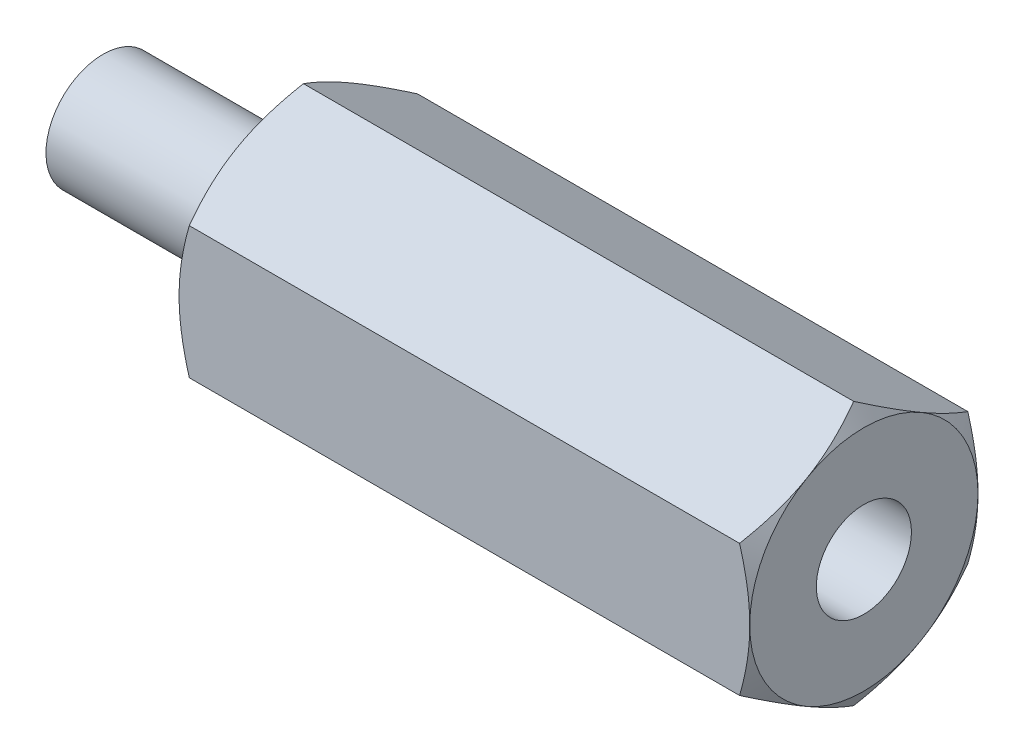
ISO-10303-21;
HEADER;
FILE_DESCRIPTION(('STEP AP214'),'2;1');
FILE_NAME('part.step','',(''),(''),'','','');
FILE_SCHEMA(('AUTOMOTIVE_DESIGN { 1 0 10303 214 1 1 1 1 }'));
ENDSEC;
DATA;
#1=APPLICATION_CONTEXT('core data for automotive mechanical design processes');
#2=APPLICATION_PROTOCOL_DEFINITION('international standard','automotive_design',2000,#1);
#3=PRODUCT_CONTEXT('',#1,'mechanical');
#4=PRODUCT('Part','Part','',(#3));
#5=PRODUCT_RELATED_PRODUCT_CATEGORY('part','',(#4));
#6=PRODUCT_DEFINITION_FORMATION('','',#4);
#7=PRODUCT_DEFINITION_CONTEXT('part definition',#1,'design');
#8=PRODUCT_DEFINITION('design','',#6,#7);
#9=PRODUCT_DEFINITION_SHAPE('','',#8);
#10=(LENGTH_UNIT() NAMED_UNIT(*) SI_UNIT(.MILLI.,.METRE.));
#11=(NAMED_UNIT(*) PLANE_ANGLE_UNIT() SI_UNIT($,.RADIAN.));
#12=(NAMED_UNIT(*) SI_UNIT($,.STERADIAN.) SOLID_ANGLE_UNIT());
#13=UNCERTAINTY_MEASURE_WITH_UNIT(LENGTH_MEASURE(1.E-05),#10,'distance_accuracy_value','');
#14=(GEOMETRIC_REPRESENTATION_CONTEXT(3) GLOBAL_UNCERTAINTY_ASSIGNED_CONTEXT((#13)) GLOBAL_UNIT_ASSIGNED_CONTEXT((#10,
#11,#12)) REPRESENTATION_CONTEXT('',''));
#15=CARTESIAN_POINT('',(0.,0.,0.));
#16=DIRECTION('',(0.,0.,1.));
#17=DIRECTION('',(1.,0.,0.));
#18=AXIS2_PLACEMENT_3D('',#15,#16,#17);
#19=CARTESIAN_POINT('',(15.,1.73205080756888,-3.));
#20=DIRECTION('',(0.,-0.866025403784439,0.5));
#21=DIRECTION('',(0.,-0.5,-0.866025403784439));
#22=AXIS2_PLACEMENT_3D('',#19,#20,#21);
#23=PLANE('',#22);
#24=CARTESIAN_POINT('',(14.731984137569,1.73193533751504,-3.0002));
#25=CARTESIAN_POINT('',(14.7759462955477,1.80805042952748,-2.86836479341167));
#26=CARTESIAN_POINT('',(14.8159284137074,1.88482254163057,-2.73539159464475));
#27=CARTESIAN_POINT('',(14.8857179195545,2.03969618244675,-2.46714257999795));
#28=CARTESIAN_POINT('',(14.9155006177346,2.11780046324563,-2.33186199736566));
#29=CARTESIAN_POINT('',(14.9618621607887,2.27304105912605,-2.06297739790352));
#30=CARTESIAN_POINT('',(14.9787495588771,2.35015348720802,-1.92941475457054));
#31=CARTESIAN_POINT('',(14.9989103575515,2.50474122256553,-1.66166094270431));
#32=CARTESIAN_POINT('',(15.0022004522189,2.58221596787771,-1.52747074752016));
#33=CARTESIAN_POINT('',(14.9953594691146,2.72698443778646,-1.2767244023042));
#34=CARTESIAN_POINT('',(14.9869080858074,2.79429982297457,-1.16013073502733));
#35=CARTESIAN_POINT('',(14.960121056993,2.92849202968483,-0.927703015025365));
#36=CARTESIAN_POINT('',(14.9417762591383,2.99536838698943,-0.811869766348671));
#37=CARTESIAN_POINT('',(14.8959152491467,3.12983731964848,-0.578962742943634));
#38=CARTESIAN_POINT('',(14.8682046147369,3.19741287398332,-0.461918449486061));
#39=CARTESIAN_POINT('',(14.8053122048626,3.33155605209904,-0.229575649500876));
#40=CARTESIAN_POINT('',(14.7701452089784,3.39812539473502,-0.114274165828894));
#41=CARTESIAN_POINT('',(14.731984137569,3.46421708519159,0.000199999999999214));
#42=B_SPLINE_CURVE_WITH_KNOTS('',3,(#24,#25,#26,#27,#28,#29,#30,#31,#32,#33,#34,#35,#36,#37,#38,
#39,#40,#41),.UNSPECIFIED.,.F.,.F.,(4,2,2,2,2,2,2,2,4),(0.,0.47553983010304,0.952222784107963,
1.41710776961288,1.88142182298026,2.28572436316091,2.69040156475039,3.10405572063576,
3.5168974940707),.UNSPECIFIED.);
#43=CARTESIAN_POINT('',(14.7320508075689,1.73205080756888,-3.));
#44=VERTEX_POINT('',#43);
#45=CARTESIAN_POINT('',(15.,2.59807621135332,-1.5));
#46=VERTEX_POINT('',#45);
#47=EDGE_CURVE('E301',#44,#46,#42,.T.);
#48=ORIENTED_EDGE('',*,*,#47,.F.);
#49=DIRECTION('',(-1.,0.,0.));
#50=VECTOR('',#49,1.);
#51=CARTESIAN_POINT('',(15.,1.73205080756888,-3.));
#52=LINE('',#51,#50);
#53=CARTESIAN_POINT('',(0.267949192431119,1.73205080756888,-3.));
#54=VERTEX_POINT('',#53);
#55=EDGE_CURVE('E253',#44,#54,#52,.T.);
#56=ORIENTED_EDGE('',*,*,#55,.T.);
#57=CARTESIAN_POINT('',(0.268015862431007,3.46421708519159,0.000199999999999696));
#58=CARTESIAN_POINT('',(0.224053704452303,3.38810199317915,-0.131635206588332));
#59=CARTESIAN_POINT('',(0.184071586292626,3.31132988107606,-0.26460840535525));
#60=CARTESIAN_POINT('',(0.114282080445464,3.15645624025988,-0.532857420002056));
#61=CARTESIAN_POINT('',(0.0844993822653796,3.078351959461,-0.668138002634341));
#62=CARTESIAN_POINT('',(0.0381378392112545,2.92311136358059,-0.937022602096482));
#63=CARTESIAN_POINT('',(0.0212504411229496,2.84599893549861,-1.07058524542946));
#64=CARTESIAN_POINT('',(0.00108964244852424,2.6914112001411,-1.33833905729569));
#65=CARTESIAN_POINT('',(-0.00220045221891911,2.61393645482892,-1.47252925247984));
#66=CARTESIAN_POINT('',(0.00464053088539067,2.46916798492017,-1.7232755976958));
#67=CARTESIAN_POINT('',(0.0130919141926166,2.40185259973206,-1.83986926497267));
#68=CARTESIAN_POINT('',(0.039878943007035,2.2676603930218,-2.07229698497464));
#69=CARTESIAN_POINT('',(0.0582237408617119,2.2007840357172,-2.18813023365133));
#70=CARTESIAN_POINT('',(0.104084750853326,2.06631510305815,-2.42103725705637));
#71=CARTESIAN_POINT('',(0.131795385263081,1.99873954872331,-2.53808155051394));
#72=CARTESIAN_POINT('',(0.194687795137399,1.86459637060759,-2.77042435049913));
#73=CARTESIAN_POINT('',(0.229854791021554,1.79802702797161,-2.88572583417111));
#74=CARTESIAN_POINT('',(0.268015862431008,1.73193533751504,-3.0002));
#75=B_SPLINE_CURVE_WITH_KNOTS('',3,(#57,#58,#59,#60,#61,#62,#63,#64,#65,#66,#67,#68,#69,#70,#71,
#72,#73,#74),.UNSPECIFIED.,.F.,.F.,(4,2,2,2,2,2,2,2,4),(0.,0.475539830103039,0.952222784107962,
1.41710776961288,1.88142182298025,2.28572436316091,2.69040156475039,3.10405572063576,
3.5168974940707),.UNSPECIFIED.);
#76=CARTESIAN_POINT('',(0.,2.59807621135332,-1.5));
#77=VERTEX_POINT('',#76);
#78=EDGE_CURVE('E310',#77,#54,#75,.T.);
#79=ORIENTED_EDGE('',*,*,#78,.F.);
#80=CARTESIAN_POINT('',(0.267949192431119,3.46410161513776,0.));
#81=VERTEX_POINT('',#80);
#82=EDGE_CURVE('E62',#81,#77,#75,.T.);
#83=ORIENTED_EDGE('',*,*,#82,.F.);
#84=DIRECTION('',(-1.,0.,0.));
#85=VECTOR('',#84,1.);
#86=CARTESIAN_POINT('',(15.,3.46410161513775,0.));
#87=LINE('',#86,#85);
#88=CARTESIAN_POINT('',(14.7320508075689,3.46410161513776,0.));
#89=VERTEX_POINT('',#88);
#90=EDGE_CURVE('E263',#89,#81,#87,.T.);
#91=ORIENTED_EDGE('',*,*,#90,.F.);
#92=EDGE_CURVE('E215',#46,#89,#42,.T.);
#93=ORIENTED_EDGE('',*,*,#92,.F.);
#94=EDGE_LOOP('',(#48,#56,#79,#83,#91,#93));
#95=FACE_BOUND('',#94,.T.);
#96=ADVANCED_FACE('F39',(#95),#23,.F.);
#97=CARTESIAN_POINT('',(15.,3.46410161513775,0.));
#98=DIRECTION('',(0.,-0.866025403784439,-0.5));
#99=DIRECTION('',(0.,0.5,-0.866025403784439));
#100=AXIS2_PLACEMENT_3D('',#97,#98,#99);
#101=PLANE('',#100);
#102=CARTESIAN_POINT('',(14.731984137569,3.46421708519159,-0.000200000000000304));
#103=CARTESIAN_POINT('',(14.7759462955477,3.38810199317915,0.131635206588331));
#104=CARTESIAN_POINT('',(14.8159284137074,3.31132988107606,0.264608405355249));
#105=CARTESIAN_POINT('',(14.8857179195545,3.15645624025988,0.532857420002055));
#106=CARTESIAN_POINT('',(14.9155006177346,3.078351959461,0.66813800263434));
#107=CARTESIAN_POINT('',(14.9618621607887,2.92311136358059,0.937022602096481));
#108=CARTESIAN_POINT('',(14.9787495588771,2.84599893549862,1.07058524542946));
#109=CARTESIAN_POINT('',(14.9989103575515,2.6914112001411,1.33833905729569));
#110=CARTESIAN_POINT('',(15.0022004522189,2.61393645482892,1.47252925247984));
#111=CARTESIAN_POINT('',(14.9953594691146,2.46916798492017,1.7232755976958));
#112=CARTESIAN_POINT('',(14.9869080858074,2.40185259973206,1.83986926497267));
#113=CARTESIAN_POINT('',(14.960121056993,2.2676603930218,2.07229698497463));
#114=CARTESIAN_POINT('',(14.9417762591383,2.2007840357172,2.18813023365133));
#115=CARTESIAN_POINT('',(14.8959152491467,2.06631510305815,2.42103725705637));
#116=CARTESIAN_POINT('',(14.8682046147369,1.99873954872331,2.53808155051394));
#117=CARTESIAN_POINT('',(14.8053122048626,1.86459637060759,2.77042435049912));
#118=CARTESIAN_POINT('',(14.7701452089784,1.79802702797161,2.88572583417111));
#119=CARTESIAN_POINT('',(14.731984137569,1.73193533751504,3.0002));
#120=B_SPLINE_CURVE_WITH_KNOTS('',3,(#102,#103,#104,#105,#106,#107,#108,#109,#110,#111,#112,
#113,#114,#115,#116,#117,#118,#119),.UNSPECIFIED.,.F.,.F.,(4,2,2,2,2,2,2,2,4),(0.,
0.47553983010304,0.952222784107961,1.41710776961288,1.88142182298025,2.28572436316091,
2.69040156475039,3.10405572063576,3.5168974940707),.UNSPECIFIED.);
#121=CARTESIAN_POINT('',(15.,2.59807621135332,1.5));
#122=VERTEX_POINT('',#121);
#123=EDGE_CURVE('E213',#89,#122,#120,.T.);
#124=ORIENTED_EDGE('',*,*,#123,.F.);
#125=ORIENTED_EDGE('',*,*,#90,.T.);
#126=CARTESIAN_POINT('',(0.268015862431008,1.73193533751504,3.0002));
#127=CARTESIAN_POINT('',(0.224053704452304,1.80805042952748,2.86836479341167));
#128=CARTESIAN_POINT('',(0.184071586292626,1.88482254163057,2.73539159464475));
#129=CARTESIAN_POINT('',(0.114282080445465,2.03969618244675,2.46714257999794));
#130=CARTESIAN_POINT('',(0.0844993822653798,2.11780046324563,2.33186199736566));
#131=CARTESIAN_POINT('',(0.0381378392112546,2.27304105912604,2.06297739790352));
#132=CARTESIAN_POINT('',(0.0212504411229497,2.35015348720802,1.92941475457054));
#133=CARTESIAN_POINT('',(0.00108964244852426,2.50474122256553,1.66166094270431));
#134=CARTESIAN_POINT('',(-0.00220045221891914,2.58221596787771,1.52747074752016));
#135=CARTESIAN_POINT('',(0.00464053088539046,2.72698443778646,1.27672440230419));
#136=CARTESIAN_POINT('',(0.0130919141926162,2.79429982297457,1.16013073502733));
#137=CARTESIAN_POINT('',(0.0398789430070344,2.92849202968483,0.927703015025364));
#138=CARTESIAN_POINT('',(0.0582237408617113,2.99536838698943,0.811869766348669));
#139=CARTESIAN_POINT('',(0.104084750853326,3.12983731964848,0.578962742943633));
#140=CARTESIAN_POINT('',(0.131795385263081,3.19741287398332,0.461918449486059));
#141=CARTESIAN_POINT('',(0.194687795137398,3.33155605209904,0.229575649500875));
#142=CARTESIAN_POINT('',(0.229854791021553,3.39812539473502,0.114274165828893));
#143=CARTESIAN_POINT('',(0.268015862431007,3.46421708519159,-0.000200000000000425));
#144=B_SPLINE_CURVE_WITH_KNOTS('',3,(#126,#127,#128,#129,#130,#131,#132,#133,#134,#135,#136,
#137,#138,#139,#140,#141,#142,#143),.UNSPECIFIED.,.F.,.F.,(4,2,2,2,2,2,2,2,4),(0.,
0.47553983010304,0.952222784107963,1.41710776961288,1.88142182298026,2.28572436316091,
2.69040156475039,3.10405572063576,3.5168974940707),.UNSPECIFIED.);
#145=CARTESIAN_POINT('',(0.,2.59807621135332,1.5));
#146=VERTEX_POINT('',#145);
#147=EDGE_CURVE('E230',#146,#81,#144,.T.);
#148=ORIENTED_EDGE('',*,*,#147,.F.);
#149=CARTESIAN_POINT('',(0.267949192431119,1.73205080756888,3.));
#150=VERTEX_POINT('',#149);
#151=EDGE_CURVE('E237',#150,#146,#144,.T.);
#152=ORIENTED_EDGE('',*,*,#151,.F.);
#153=DIRECTION('',(-1.,0.,0.));
#154=VECTOR('',#153,1.);
#155=CARTESIAN_POINT('',(15.,1.73205080756888,3.));
#156=LINE('',#155,#154);
#157=CARTESIAN_POINT('',(14.7320508075689,1.73205080756888,3.));
#158=VERTEX_POINT('',#157);
#159=EDGE_CURVE('E261',#158,#150,#156,.T.);
#160=ORIENTED_EDGE('',*,*,#159,.F.);
#161=EDGE_CURVE('E207',#122,#158,#120,.T.);
#162=ORIENTED_EDGE('',*,*,#161,.F.);
#163=EDGE_LOOP('',(#124,#125,#148,#152,#160,#162));
#164=FACE_BOUND('',#163,.T.);
#165=ADVANCED_FACE('F221',(#164),#101,.F.);
#166=CARTESIAN_POINT('',(15.,1.73205080756888,3.));
#167=DIRECTION('',(0.,0.,-1.));
#168=DIRECTION('',(-1.,0.,0.));
#169=AXIS2_PLACEMENT_3D('',#166,#167,#168);
#170=PLANE('',#169);
#171=CARTESIAN_POINT('',(13.5644198840695,-4.59365399246919,3.));
#172=CARTESIAN_POINT('',(13.6280727969249,-4.46193702779007,3.));
#173=CARTESIAN_POINT('',(13.6910929471445,-4.32990864071464,3.));
#174=CARTESIAN_POINT('',(13.8155061399022,-4.06506063583465,3.));
#175=CARTESIAN_POINT('',(13.8768989007246,-3.93224088584945,3.));
#176=CARTESIAN_POINT('',(13.9980191527061,-3.6649242876475,3.));
#177=CARTESIAN_POINT('',(14.0577351037027,-3.53042219167021,3.));
#178=CARTESIAN_POINT('',(14.1746020609348,-3.26031251060447,3.));
#179=CARTESIAN_POINT('',(14.231753200869,-3.12470498357652,3.));
#180=CARTESIAN_POINT('',(14.3434870122042,-2.85048530058732,3.));
#181=CARTESIAN_POINT('',(14.3980295368381,-2.71185669617077,3.));
#182=CARTESIAN_POINT('',(14.5028428267804,-2.43296435096226,3.));
#183=CARTESIAN_POINT('',(14.5531131168251,-2.2927004302185,3.));
#184=CARTESIAN_POINT('',(14.6480311886768,-2.01060238690327,3.));
#185=CARTESIAN_POINT('',(14.6926909239121,-1.86877232784636,3.));
#186=CARTESIAN_POINT('',(14.7749374825916,-1.58309590976888,3.));
#187=CARTESIAN_POINT('',(14.8125265427424,-1.43925020389311,3.));
#188=CARTESIAN_POINT('',(14.8788069037845,-1.1494442452365,3.));
#189=CARTESIAN_POINT('',(14.9074958355326,-1.00348344023737,3.));
#190=CARTESIAN_POINT('',(14.9540443230582,-0.709802044404414,3.));
#191=CARTESIAN_POINT('',(14.9719038692612,-0.56208145201483,3.));
#192=CARTESIAN_POINT('',(14.9952136401379,-0.266588992220957,3.));
#193=CARTESIAN_POINT('',(15.0007424255708,-0.118823483320509,3.));
#194=CARTESIAN_POINT('',(14.9990969502189,0.1766040642056,3.));
#195=CARTESIAN_POINT('',(14.9919259868885,0.324266119734152,3.));
#196=CARTESIAN_POINT('',(14.9693409490398,0.576420476419138,3.));
#197=CARTESIAN_POINT('',(14.9568680279671,0.681190963786368,3.));
#198=CARTESIAN_POINT('',(14.92633994224,0.889922617976238,3.));
#199=CARTESIAN_POINT('',(14.9082838972062,0.99388365450761,3.));
#200=CARTESIAN_POINT('',(14.8466886967873,1.30446784089729,3.));
#201=CARTESIAN_POINT('',(14.7957383351811,1.50963517896544,3.));
#202=CARTESIAN_POINT('',(14.7078627305121,1.81663689760896,3.));
#203=CARTESIAN_POINT('',(14.6762145436413,1.92007152271157,3.));
#204=CARTESIAN_POINT('',(14.6097865648292,2.12586119326056,3.));
#205=CARTESIAN_POINT('',(14.5750089328598,2.22821692967672,3.));
#206=CARTESIAN_POINT('',(14.5030457256148,2.4314208038726,3.));
#207=CARTESIAN_POINT('',(14.4658748056849,2.53227418460133,3.));
#208=CARTESIAN_POINT('',(14.389351234657,2.7331984586469,3.));
#209=CARTESIAN_POINT('',(14.3499977017775,2.83326901679546,3.));
#210=CARTESIAN_POINT('',(14.3097682450936,2.93297774240019,3.));
#211=B_SPLINE_CURVE_WITH_KNOTS('',3,(#171,#172,#173,#174,#175,#176,#177,#178,#179,#180,#181,
#182,#183,#184,#185,#186,#187,#188,#189,#190,#191,#192,#193,#194,#195,#196,#197,#198,#199,#200,
#201,#202,#203,#204,#205,#206,#207,#208,#209,#210),.UNSPECIFIED.,.F.,.F.,(4,2,2,2,2,2,2,2,2,2,2,
2,2,2,2,2,2,2,2,4),(0.,0.438878844399204,0.877833172949452,1.31929945984492,1.7607427071362,
2.20760550748112,2.65451795408016,3.100461485232,3.54626371043603,3.99218450300883,
4.43810568983108,4.88117764390526,5.32413457244913,5.6405110561914,5.9569374534813,
6.59026118519874,6.91473961423269,7.23899577837226,7.56142681097231,7.88398906914356),.UNSPECIFIED.);
#212=CARTESIAN_POINT('',(15.,0.,3.));
#213=VERTEX_POINT('',#212);
#214=EDGE_CURVE('E214',#158,#213,#211,.F.);
#215=ORIENTED_EDGE('',*,*,#214,.F.);
#216=ORIENTED_EDGE('',*,*,#159,.T.);
#217=CARTESIAN_POINT('',(1.43558011593046,-4.59365399246919,3.));
#218=CARTESIAN_POINT('',(1.37192720307515,-4.46193702779007,3.));
#219=CARTESIAN_POINT('',(1.30890705285553,-4.32990864071464,3.));
#220=CARTESIAN_POINT('',(1.18449386009785,-4.06506063583465,3.));
#221=CARTESIAN_POINT('',(1.1231010992754,-3.93224088584945,3.));
#222=CARTESIAN_POINT('',(1.0019808472939,-3.6649242876475,3.));
#223=CARTESIAN_POINT('',(0.942264896297261,-3.53042219167021,3.));
#224=CARTESIAN_POINT('',(0.825397939065208,-3.26031251060447,3.));
#225=CARTESIAN_POINT('',(0.768246799131001,-3.12470498357653,3.));
#226=CARTESIAN_POINT('',(0.656512987795759,-2.85048530058733,3.));
#227=CARTESIAN_POINT('',(0.601970463161873,-2.71185669617077,3.));
#228=CARTESIAN_POINT('',(0.497157173219555,-2.43296435096226,3.));
#229=CARTESIAN_POINT('',(0.446886883174869,-2.2927004302185,3.));
#230=CARTESIAN_POINT('',(0.351968811323154,-2.01060238690328,3.));
#231=CARTESIAN_POINT('',(0.307309076087872,-1.86877232784636,3.));
#232=CARTESIAN_POINT('',(0.225062517408375,-1.58309590976888,3.));
#233=CARTESIAN_POINT('',(0.18747345725756,-1.43925020389311,3.));
#234=CARTESIAN_POINT('',(0.121193096215529,-1.1494442452365,3.));
#235=CARTESIAN_POINT('',(0.0925041644674031,-1.00348344023737,3.));
#236=CARTESIAN_POINT('',(0.0459556769417565,-0.709802044404415,3.));
#237=CARTESIAN_POINT('',(0.0280961307387734,-0.56208145201483,3.));
#238=CARTESIAN_POINT('',(0.00478635986207677,-0.266588992220958,3.));
#239=CARTESIAN_POINT('',(-0.000742425570781302,-0.11882348332051,3.));
#240=CARTESIAN_POINT('',(0.000903049781096446,0.176604064205599,3.));
#241=CARTESIAN_POINT('',(0.00807401311151268,0.324266119734152,3.));
#242=CARTESIAN_POINT('',(0.0306590509601924,0.576420476419137,3.));
#243=CARTESIAN_POINT('',(0.0431319720329318,0.681190963786367,3.));
#244=CARTESIAN_POINT('',(0.0736600577600187,0.889922617976236,3.));
#245=CARTESIAN_POINT('',(0.0917161027938349,0.993883654507608,3.));
#246=CARTESIAN_POINT('',(0.153311303212674,1.30446784089728,3.));
#247=CARTESIAN_POINT('',(0.204261664818867,1.50963517896544,3.));
#248=CARTESIAN_POINT('',(0.292137269487906,1.81663689760895,3.));
#249=CARTESIAN_POINT('',(0.323785456358731,1.92007152271157,3.));
#250=CARTESIAN_POINT('',(0.390213435170826,2.12586119326056,3.));
#251=CARTESIAN_POINT('',(0.424991067140189,2.22821692967671,3.));
#252=CARTESIAN_POINT('',(0.496954274385221,2.43142080387259,3.));
#253=CARTESIAN_POINT('',(0.534125194315132,2.53227418460133,3.));
#254=CARTESIAN_POINT('',(0.610648765343034,2.7331984586469,3.));
#255=CARTESIAN_POINT('',(0.650002298222535,2.83326901679545,3.));
#256=CARTESIAN_POINT('',(0.690231754906353,2.93297774240018,3.));
#257=B_SPLINE_CURVE_WITH_KNOTS('',3,(#217,#218,#219,#220,#221,#222,#223,#224,#225,#226,#227,
#228,#229,#230,#231,#232,#233,#234,#235,#236,#237,#238,#239,#240,#241,#242,#243,#244,#245,#246,
#247,#248,#249,#250,#251,#252,#253,#254,#255,#256),.UNSPECIFIED.,.F.,.F.,(4,2,2,2,2,2,2,2,2,2,2,
2,2,2,2,2,2,2,2,4),(0.,0.438878844399203,0.87783317294945,1.31929945984492,1.7607427071362,
2.20760550748112,2.65451795408016,3.100461485232,3.54626371043602,3.99218450300883,
4.43810568983108,4.88117764390526,5.32413457244913,5.6405110561914,5.9569374534813,
6.59026118519873,6.91473961423269,7.23899577837225,7.56142681097231,7.88398906914355),.UNSPECIFIED.);
#258=CARTESIAN_POINT('',(0.,0.,3.));
#259=VERTEX_POINT('',#258);
#260=EDGE_CURVE('E244',#259,#150,#257,.T.);
#261=ORIENTED_EDGE('',*,*,#260,.F.);
#262=CARTESIAN_POINT('',(0.267949192431119,-1.73205080756888,3.));
#263=VERTEX_POINT('',#262);
#264=EDGE_CURVE('E251',#263,#259,#257,.T.);
#265=ORIENTED_EDGE('',*,*,#264,.F.);
#266=DIRECTION('',(-1.,0.,0.));
#267=VECTOR('',#266,1.);
#268=CARTESIAN_POINT('',(15.,-1.73205080756888,3.));
#269=LINE('',#268,#267);
#270=CARTESIAN_POINT('',(14.7320508075689,-1.73205080756888,3.));
#271=VERTEX_POINT('',#270);
#272=EDGE_CURVE('E259',#271,#263,#269,.T.);
#273=ORIENTED_EDGE('',*,*,#272,.F.);
#274=EDGE_CURVE('E200',#213,#271,#211,.F.);
#275=ORIENTED_EDGE('',*,*,#274,.F.);
#276=EDGE_LOOP('',(#215,#216,#261,#265,#273,#275));
#277=FACE_BOUND('',#276,.T.);
#278=ADVANCED_FACE('F224',(#277),#170,.F.);
#279=CARTESIAN_POINT('',(15.,-1.73205080756888,3.));
#280=DIRECTION('',(0.,0.866025403784439,-0.5));
#281=DIRECTION('',(0.,0.5,0.866025403784439));
#282=AXIS2_PLACEMENT_3D('',#279,#280,#281);
#283=PLANE('',#282);
#284=CARTESIAN_POINT('',(14.731984137569,-1.73193533751504,3.0002));
#285=CARTESIAN_POINT('',(14.7759462955477,-1.80805042952748,2.86836479341167));
#286=CARTESIAN_POINT('',(14.8159284137074,-1.88482254163057,2.73539159464475));
#287=CARTESIAN_POINT('',(14.8857179195545,-2.03969618244675,2.46714257999795));
#288=CARTESIAN_POINT('',(14.9155006177346,-2.11780046324563,2.33186199736566));
#289=CARTESIAN_POINT('',(14.9618621607887,-2.27304105912605,2.06297739790352));
#290=CARTESIAN_POINT('',(14.9787495588771,-2.35015348720802,1.92941475457054));
#291=CARTESIAN_POINT('',(14.9989103575515,-2.50474122256553,1.66166094270431));
#292=CARTESIAN_POINT('',(15.0022004522189,-2.58221596787771,1.52747074752016));
#293=CARTESIAN_POINT('',(14.9953594691146,-2.72698443778646,1.2767244023042));
#294=CARTESIAN_POINT('',(14.9869080858074,-2.79429982297457,1.16013073502733));
#295=CARTESIAN_POINT('',(14.960121056993,-2.92849202968483,0.927703015025365));
#296=CARTESIAN_POINT('',(14.9417762591383,-2.99536838698943,0.81186976634867));
#297=CARTESIAN_POINT('',(14.8959152491467,-3.12983731964848,0.578962742943633));
#298=CARTESIAN_POINT('',(14.8682046147369,-3.19741287398332,0.46191844948606));
#299=CARTESIAN_POINT('',(14.8053122048626,-3.33155605209904,0.229575649500876));
#300=CARTESIAN_POINT('',(14.7701452089784,-3.39812539473502,0.114274165828894));
#301=CARTESIAN_POINT('',(14.731984137569,-3.46421708519159,-0.000199999999999502));
#302=B_SPLINE_CURVE_WITH_KNOTS('',3,(#284,#285,#286,#287,#288,#289,#290,#291,#292,#293,#294,
#295,#296,#297,#298,#299,#300,#301),.UNSPECIFIED.,.F.,.F.,(4,2,2,2,2,2,2,2,4),(0.,
0.475539830103039,0.952222784107962,1.41710776961288,1.88142182298025,2.28572436316091,
2.69040156475039,3.10405572063576,3.5168974940707),.UNSPECIFIED.);
#303=CARTESIAN_POINT('',(15.,-2.59807621135332,1.5));
#304=VERTEX_POINT('',#303);
#305=EDGE_CURVE('E564',#271,#304,#302,.T.);
#306=ORIENTED_EDGE('',*,*,#305,.F.);
#307=ORIENTED_EDGE('',*,*,#272,.T.);
#308=CARTESIAN_POINT('',(0.268015862431008,-3.46421708519159,-0.00019999999999964));
#309=CARTESIAN_POINT('',(0.224053704452304,-3.38810199317915,0.131635206588332));
#310=CARTESIAN_POINT('',(0.184071586292626,-3.31132988107606,0.264608405355249));
#311=CARTESIAN_POINT('',(0.114282080445465,-3.15645624025988,0.532857420002055));
#312=CARTESIAN_POINT('',(0.0844993822653802,-3.078351959461,0.668138002634341));
#313=CARTESIAN_POINT('',(0.0381378392112551,-2.92311136358059,0.937022602096482));
#314=CARTESIAN_POINT('',(0.0212504411229501,-2.84599893549862,1.07058524542946));
#315=CARTESIAN_POINT('',(0.00108964244852469,-2.6914112001411,1.33833905729569));
#316=CARTESIAN_POINT('',(-0.00220045221891865,-2.61393645482892,1.47252925247984));
#317=CARTESIAN_POINT('',(0.00464053088539098,-2.46916798492017,1.72327559769581));
#318=CARTESIAN_POINT('',(0.0130919141926167,-2.40185259973206,1.83986926497267));
#319=CARTESIAN_POINT('',(0.039878943007035,-2.2676603930218,2.07229698497464));
#320=CARTESIAN_POINT('',(0.058223740861712,-2.2007840357172,2.18813023365133));
#321=CARTESIAN_POINT('',(0.104084750853326,-2.06631510305815,2.42103725705637));
#322=CARTESIAN_POINT('',(0.131795385263081,-1.99873954872331,2.53808155051394));
#323=CARTESIAN_POINT('',(0.194687795137399,-1.86459637060759,2.77042435049912));
#324=CARTESIAN_POINT('',(0.229854791021554,-1.79802702797161,2.88572583417111));
#325=CARTESIAN_POINT('',(0.268015862431008,-1.73193533751504,3.0002));
#326=B_SPLINE_CURVE_WITH_KNOTS('',3,(#308,#309,#310,#311,#312,#313,#314,#315,#316,#317,#318,
#319,#320,#321,#322,#323,#324,#325),.UNSPECIFIED.,.F.,.F.,(4,2,2,2,2,2,2,2,4),(0.,
0.47553983010304,0.952222784107962,1.41710776961288,1.88142182298026,2.28572436316091,
2.69040156475039,3.10405572063576,3.5168974940707),.UNSPECIFIED.);
#327=CARTESIAN_POINT('',(0.,-2.59807621135332,1.5));
#328=VERTEX_POINT('',#327);
#329=EDGE_CURVE('E252',#328,#263,#326,.T.);
#330=ORIENTED_EDGE('',*,*,#329,.F.);
#331=CARTESIAN_POINT('',(0.267949192431119,-3.46410161513775,0.));
#332=VERTEX_POINT('',#331);
#333=EDGE_CURVE('E238',#332,#328,#326,.T.);
#334=ORIENTED_EDGE('',*,*,#333,.F.);
#335=DIRECTION('',(-1.,0.,0.));
#336=VECTOR('',#335,1.);
#337=CARTESIAN_POINT('',(15.,-3.46410161513775,0.));
#338=LINE('',#337,#336);
#339=CARTESIAN_POINT('',(14.7320508075689,-3.46410161513776,0.));
#340=VERTEX_POINT('',#339);
#341=EDGE_CURVE('E257',#340,#332,#338,.T.);
#342=ORIENTED_EDGE('',*,*,#341,.F.);
#343=EDGE_CURVE('E193',#304,#340,#302,.T.);
#344=ORIENTED_EDGE('',*,*,#343,.F.);
#345=EDGE_LOOP('',(#306,#307,#330,#334,#342,#344));
#346=FACE_BOUND('',#345,.T.);
#347=ADVANCED_FACE('F334',(#346),#283,.F.);
#348=CARTESIAN_POINT('',(15.,-3.46410161513775,0.));
#349=DIRECTION('',(0.,0.866025403784439,0.5));
#350=DIRECTION('',(0.,-0.5,0.866025403784439));
#351=AXIS2_PLACEMENT_3D('',#348,#349,#350);
#352=PLANE('',#351);
#353=CARTESIAN_POINT('',(14.731984137569,-3.46421708519159,0.00020000000000058));
#354=CARTESIAN_POINT('',(14.7759462955477,-3.38810199317915,-0.131635206588332));
#355=CARTESIAN_POINT('',(14.8159284137074,-3.31132988107606,-0.264608405355249));
#356=CARTESIAN_POINT('',(14.8857179195545,-3.15645624025988,-0.532857420002055));
#357=CARTESIAN_POINT('',(14.9155006177346,-3.078351959461,-0.668138002634341));
#358=CARTESIAN_POINT('',(14.9618621607887,-2.92311136358059,-0.937022602096482));
#359=CARTESIAN_POINT('',(14.9787495588771,-2.84599893549862,-1.07058524542946));
#360=CARTESIAN_POINT('',(14.9989103575515,-2.6914112001411,-1.33833905729569));
#361=CARTESIAN_POINT('',(15.0022004522189,-2.61393645482892,-1.47252925247984));
#362=CARTESIAN_POINT('',(14.9953594691146,-2.46916798492017,-1.72327559769581));
#363=CARTESIAN_POINT('',(14.9869080858074,-2.40185259973206,-1.83986926497267));
#364=CARTESIAN_POINT('',(14.960121056993,-2.2676603930218,-2.07229698497464));
#365=CARTESIAN_POINT('',(14.9417762591383,-2.2007840357172,-2.18813023365133));
#366=CARTESIAN_POINT('',(14.8959152491467,-2.06631510305815,-2.42103725705637));
#367=CARTESIAN_POINT('',(14.8682046147369,-1.99873954872331,-2.53808155051394));
#368=CARTESIAN_POINT('',(14.8053122048626,-1.86459637060759,-2.77042435049913));
#369=CARTESIAN_POINT('',(14.7701452089784,-1.79802702797161,-2.88572583417111));
#370=CARTESIAN_POINT('',(14.731984137569,-1.73193533751504,-3.0002));
#371=B_SPLINE_CURVE_WITH_KNOTS('',3,(#353,#354,#355,#356,#357,#358,#359,#360,#361,#362,#363,
#364,#365,#366,#367,#368,#369,#370),.UNSPECIFIED.,.F.,.F.,(4,2,2,2,2,2,2,2,4),(0.,
0.47553983010304,0.952222784107963,1.41710776961288,1.88142182298026,2.28572436316091,
2.69040156475039,3.10405572063576,3.5168974940707),.UNSPECIFIED.);
#372=CARTESIAN_POINT('',(15.,-2.59807621135332,-1.5));
#373=VERTEX_POINT('',#372);
#374=EDGE_CURVE('E293',#340,#373,#371,.T.);
#375=ORIENTED_EDGE('',*,*,#374,.F.);
#376=ORIENTED_EDGE('',*,*,#341,.T.);
#377=CARTESIAN_POINT('',(0.268015862431008,-1.73193533751504,-3.0002));
#378=CARTESIAN_POINT('',(0.224053704452305,-1.80805042952748,-2.86836479341167));
#379=CARTESIAN_POINT('',(0.184071586292627,-1.88482254163057,-2.73539159464475));
#380=CARTESIAN_POINT('',(0.114282080445465,-2.03969618244675,-2.46714257999795));
#381=CARTESIAN_POINT('',(0.0844993822653804,-2.11780046324563,-2.33186199736566));
#382=CARTESIAN_POINT('',(0.0381378392112551,-2.27304105912604,-2.06297739790352));
#383=CARTESIAN_POINT('',(0.0212504411229502,-2.35015348720802,-1.92941475457054));
#384=CARTESIAN_POINT('',(0.00108964244852465,-2.50474122256553,-1.66166094270431));
#385=CARTESIAN_POINT('',(-0.00220045221891885,-2.58221596787771,-1.52747074752016));
#386=CARTESIAN_POINT('',(0.00464053088539056,-2.72698443778646,-1.2767244023042));
#387=CARTESIAN_POINT('',(0.0130919141926162,-2.79429982297457,-1.16013073502733));
#388=CARTESIAN_POINT('',(0.0398789430070346,-2.92849202968483,-0.927703015025365));
#389=CARTESIAN_POINT('',(0.0582237408617117,-2.99536838698943,-0.81186976634867));
#390=CARTESIAN_POINT('',(0.104084750853326,-3.12983731964848,-0.578962742943633));
#391=CARTESIAN_POINT('',(0.131795385263081,-3.19741287398332,-0.46191844948606));
#392=CARTESIAN_POINT('',(0.194687795137398,-3.33155605209904,-0.229575649500875));
#393=CARTESIAN_POINT('',(0.229854791021554,-3.39812539473502,-0.114274165828893));
#394=CARTESIAN_POINT('',(0.268015862431008,-3.46421708519159,0.000200000000000596));
#395=B_SPLINE_CURVE_WITH_KNOTS('',3,(#377,#378,#379,#380,#381,#382,#383,#384,#385,#386,#387,
#388,#389,#390,#391,#392,#393,#394),.UNSPECIFIED.,.F.,.F.,(4,2,2,2,2,2,2,2,4),(0.,
0.47553983010304,0.952222784107963,1.41710776961288,1.88142182298026,2.28572436316091,
2.69040156475039,3.10405572063576,3.5168974940707),.UNSPECIFIED.);
#396=CARTESIAN_POINT('',(0.,-2.59807621135332,-1.5));
#397=VERTEX_POINT('',#396);
#398=EDGE_CURVE('E315',#397,#332,#395,.T.);
#399=ORIENTED_EDGE('',*,*,#398,.F.);
#400=CARTESIAN_POINT('',(0.267949192431119,-1.73205080756887,-3.));
#401=VERTEX_POINT('',#400);
#402=EDGE_CURVE('E314',#401,#397,#395,.T.);
#403=ORIENTED_EDGE('',*,*,#402,.F.);
#404=DIRECTION('',(-1.,0.,0.));
#405=VECTOR('',#404,1.);
#406=CARTESIAN_POINT('',(15.,-1.73205080756888,-3.));
#407=LINE('',#406,#405);
#408=CARTESIAN_POINT('',(14.7320508075689,-1.73205080756888,-3.));
#409=VERTEX_POINT('',#408);
#410=EDGE_CURVE('E255',#409,#401,#407,.T.);
#411=ORIENTED_EDGE('',*,*,#410,.F.);
#412=EDGE_CURVE('E163',#373,#409,#371,.T.);
#413=ORIENTED_EDGE('',*,*,#412,.F.);
#414=EDGE_LOOP('',(#375,#376,#399,#403,#411,#413));
#415=FACE_BOUND('',#414,.T.);
#416=ADVANCED_FACE('F292',(#415),#352,.F.);
#417=CARTESIAN_POINT('',(15.,-1.73205080756888,-3.));
#418=DIRECTION('',(0.,0.,1.));
#419=DIRECTION('',(0.,-1.,0.));
#420=AXIS2_PLACEMENT_3D('',#417,#418,#419);
#421=PLANE('',#420);
#422=CARTESIAN_POINT('',(13.5644193664475,-4.5936550632739,-3.));
#423=CARTESIAN_POINT('',(13.6280723014505,-4.46193806193921,-3.));
#424=CARTESIAN_POINT('',(13.6910924738047,-4.32990963818021,-3.));
#425=CARTESIAN_POINT('',(13.8155057107137,-4.06506155981042,-3.));
#426=CARTESIAN_POINT('',(13.8768984935529,-3.93224177301896,-3.));
#427=CARTESIAN_POINT('',(13.9980187895789,-3.66492510058907,-3.));
#428=CARTESIAN_POINT('',(14.0577347625987,-3.5304229671875,-3.));
#429=CARTESIAN_POINT('',(14.1746017634717,-3.26031321099483,-3.));
#430=CARTESIAN_POINT('',(14.2317529250239,-3.12470564626427,-3.));
#431=CARTESIAN_POINT('',(14.3434867792231,-2.85048588685442,-3.));
#432=CARTESIAN_POINT('',(14.3980293250916,-2.71185724371337,-3.));
#433=CARTESIAN_POINT('',(14.5028426563253,-2.43296482040767,-3.));
#434=CARTESIAN_POINT('',(14.5531129664265,-2.29270086029105,-3.));
#435=CARTESIAN_POINT('',(14.6480310763942,-2.01060273748631,-3.));
#436=CARTESIAN_POINT('',(14.6926908296956,-1.86877263831546,-3.));
#437=CARTESIAN_POINT('',(14.7749374214504,-1.58309613890589,-3.));
#438=CARTESIAN_POINT('',(14.8125264966124,-1.43925039181263,-3.));
#439=CARTESIAN_POINT('',(14.8788068880238,-1.14944432791497,-3.));
#440=CARTESIAN_POINT('',(14.9074958338073,-1.00348345858387,-3.));
#441=CARTESIAN_POINT('',(14.9540443395923,-0.709801932641894,-3.));
#442=CARTESIAN_POINT('',(14.9719038900262,-0.562081274476394,-3.));
#443=CARTESIAN_POINT('',(14.9952136577863,-0.266588683448606,-3.));
#444=CARTESIAN_POINT('',(15.0007424359685,-0.118823109094477,-3.));
#445=CARTESIAN_POINT('',(14.9990969349384,0.176604568225076,-3.));
#446=CARTESIAN_POINT('',(14.991925953178,0.324266688093663,-3.));
#447=CARTESIAN_POINT('',(14.9693408784322,0.57642112704741,-3.));
#448=CARTESIAN_POINT('',(14.9568679425915,0.6811916330587,-3.));
#449=CARTESIAN_POINT('',(14.926339826515,0.889923323753458,-3.));
#450=CARTESIAN_POINT('',(14.9082837658996,0.993884378145533,-3.));
#451=CARTESIAN_POINT('',(14.8466885183574,1.30446861725756,-3.));
#452=CARTESIAN_POINT('',(14.7957381248618,1.50963598921609,-3.));
#453=CARTESIAN_POINT('',(14.7078624730202,1.81663775851165,-3.));
#454=CARTESIAN_POINT('',(14.6762142703115,1.92007240077836,-3.));
#455=CARTESIAN_POINT('',(14.6097862602807,2.12586210546067,-3.));
#456=CARTESIAN_POINT('',(14.5750086129306,2.22821785884633,-3.));
#457=CARTESIAN_POINT('',(14.5030453755264,2.43142176673509,-3.));
#458=CARTESIAN_POINT('',(14.4658744408176,2.53227516418838,-3.));
#459=CARTESIAN_POINT('',(14.389350840677,2.7331994717196,-3.));
#460=CARTESIAN_POINT('',(14.3499972934633,2.83327004662901,-3.));
#461=CARTESIAN_POINT('',(14.3097678226654,2.93297878902292,-3.));
#462=B_SPLINE_CURVE_WITH_KNOTS('',3,(#422,#423,#424,#425,#426,#427,#428,#429,#430,#431,#432,
#433,#434,#435,#436,#437,#438,#439,#440,#441,#442,#443,#444,#445,#446,#447,#448,#449,#450,#451,
#452,#453,#454,#455,#456,#457,#458,#459,#460,#461),.UNSPECIFIED.,.F.,.F.,(4,2,2,2,2,2,2,2,2,2,2,
2,2,2,2,2,2,2,2,4),(0.,0.438878972321589,0.877833428815443,1.31929984513467,1.76074322183934,
2.20760615360299,2.65451873166517,3.10046239380698,3.54626474989472,3.99218573952054,
4.43810712310573,4.88117927184296,5.32413639518722,5.64051293969399,5.95693939775845,
6.59026325136608,6.9147417435626,7.23899797076885,7.56142906579434,7.88399138651435),.UNSPECIFIED.);
#463=CARTESIAN_POINT('',(15.,0.,-3.));
#464=VERTEX_POINT('',#463);
#465=EDGE_CURVE('E162',#409,#464,#462,.T.);
#466=ORIENTED_EDGE('',*,*,#465,.F.);
#467=ORIENTED_EDGE('',*,*,#410,.T.);
#468=CARTESIAN_POINT('',(1.43558063355247,-4.5936550632739,-3.));
#469=CARTESIAN_POINT('',(1.37192769854953,-4.46193806193921,-3.));
#470=CARTESIAN_POINT('',(1.30890752619529,-4.32990963818021,-3.));
#471=CARTESIAN_POINT('',(1.18449428928626,-4.06506155981042,-3.));
#472=CARTESIAN_POINT('',(1.1231015064471,-3.93224177301897,-3.));
#473=CARTESIAN_POINT('',(1.00198121042107,-3.66492510058907,-3.));
#474=CARTESIAN_POINT('',(0.942265237401305,-3.5304229671875,-3.));
#475=CARTESIAN_POINT('',(0.825398236528256,-3.26031321099484,-3.));
#476=CARTESIAN_POINT('',(0.768247074976135,-3.12470564626427,-3.));
#477=CARTESIAN_POINT('',(0.656513220776859,-2.85048588685443,-3.));
#478=CARTESIAN_POINT('',(0.601970674908422,-2.71185724371337,-3.));
#479=CARTESIAN_POINT('',(0.497157343674687,-2.43296482040768,-3.));
#480=CARTESIAN_POINT('',(0.446887033573549,-2.29270086029106,-3.));
#481=CARTESIAN_POINT('',(0.351968923605782,-2.01060273748631,-3.));
#482=CARTESIAN_POINT('',(0.307309170304389,-1.86877263831546,-3.));
#483=CARTESIAN_POINT('',(0.225062578549614,-1.58309613890589,-3.));
#484=CARTESIAN_POINT('',(0.187473503387642,-1.43925039181263,-3.));
#485=CARTESIAN_POINT('',(0.121193111976199,-1.14944432791497,-3.));
#486=CARTESIAN_POINT('',(0.0925041661926722,-1.00348345858387,-3.));
#487=CARTESIAN_POINT('',(0.0459556604077354,-0.709801932641893,-3.));
#488=CARTESIAN_POINT('',(0.028096109973823,-0.562081274476393,-3.));
#489=CARTESIAN_POINT('',(0.00478634221371104,-0.266588683448606,-3.));
#490=CARTESIAN_POINT('',(-0.000742435968459777,-0.118823109094476,-3.));
#491=CARTESIAN_POINT('',(0.000903065061579993,0.176604568225076,-3.));
#492=CARTESIAN_POINT('',(0.00807404682195406,0.324266688093664,-3.));
#493=CARTESIAN_POINT('',(0.0306591215677535,0.57642112704741,-3.));
#494=CARTESIAN_POINT('',(0.0431320574085348,0.681191633058699,-3.));
#495=CARTESIAN_POINT('',(0.0736601734850487,0.889923323753457,-3.));
#496=CARTESIAN_POINT('',(0.0917162341003862,0.993884378145533,-3.));
#497=CARTESIAN_POINT('',(0.153311481642567,1.30446861725756,-3.));
#498=CARTESIAN_POINT('',(0.204261875138235,1.50963598921609,-3.));
#499=CARTESIAN_POINT('',(0.292137526979837,1.81663775851165,-3.));
#500=CARTESIAN_POINT('',(0.323785729688502,1.92007240077836,-3.));
#501=CARTESIAN_POINT('',(0.390213739719329,2.12586210546067,-3.));
#502=CARTESIAN_POINT('',(0.424991387069374,2.22821785884632,-3.));
#503=CARTESIAN_POINT('',(0.496954624473559,2.43142176673509,-3.));
#504=CARTESIAN_POINT('',(0.534125559182373,2.53227516418837,-3.));
#505=CARTESIAN_POINT('',(0.610649159322961,2.7331994717196,-3.));
#506=CARTESIAN_POINT('',(0.650002706536715,2.83327004662901,-3.));
#507=CARTESIAN_POINT('',(0.690232177334565,2.93297878902292,-3.));
#508=B_SPLINE_CURVE_WITH_KNOTS('',3,(#468,#469,#470,#471,#472,#473,#474,#475,#476,#477,#478,
#479,#480,#481,#482,#483,#484,#485,#486,#487,#488,#489,#490,#491,#492,#493,#494,#495,#496,#497,
#498,#499,#500,#501,#502,#503,#504,#505,#506,#507),.UNSPECIFIED.,.F.,.F.,(4,2,2,2,2,2,2,2,2,2,2,
2,2,2,2,2,2,2,2,4),(0.,0.438878972321588,0.877833428815442,1.31929984513467,1.76074322183933,
2.20760615360299,2.65451873166517,3.10046239380698,3.54626474989472,3.99218573952055,
4.43810712310573,4.88117927184296,5.32413639518722,5.64051293969399,5.95693939775845,
6.59026325136608,6.9147417435626,7.23899797076885,7.56142906579434,7.88399138651435),.UNSPECIFIED.);
#509=CARTESIAN_POINT('',(0.,0.,-3.));
#510=VERTEX_POINT('',#509);
#511=EDGE_CURVE('E327',#510,#401,#508,.F.);
#512=ORIENTED_EDGE('',*,*,#511,.F.);
#513=EDGE_CURVE('E306',#54,#510,#508,.F.);
#514=ORIENTED_EDGE('',*,*,#513,.F.);
#515=ORIENTED_EDGE('',*,*,#55,.F.);
#516=EDGE_CURVE('E154',#464,#44,#462,.T.);
#517=ORIENTED_EDGE('',*,*,#516,.F.);
#518=EDGE_LOOP('',(#466,#467,#512,#514,#515,#517));
#519=FACE_BOUND('',#518,.T.);
#520=ADVANCED_FACE('F170',(#519),#421,.F.);
#521=CARTESIAN_POINT('',(0.,0.,0.));
#522=DIRECTION('',(1.,0.,0.));
#523=DIRECTION('',(0.,0.,-1.));
#524=AXIS2_PLACEMENT_3D('',#521,#522,#523);
#525=CONICAL_SURFACE('',#524,3.,1.0471975511966);
#526=ORIENTED_EDGE('',*,*,#402,.T.);
#527=CARTESIAN_POINT('',(0.,0.,0.));
#528=DIRECTION('',(1.,0.,0.));
#529=DIRECTION('',(0.,0.,-1.));
#530=AXIS2_PLACEMENT_3D('',#527,#528,#529);
#531=CIRCLE('',#530,3.);
#532=EDGE_CURVE('E265',#397,#510,#531,.T.);
#533=ORIENTED_EDGE('',*,*,#532,.T.);
#534=ORIENTED_EDGE('',*,*,#511,.T.);
#535=EDGE_LOOP('',(#526,#533,#534));
#536=FACE_BOUND('',#535,.T.);
#537=ADVANCED_FACE('F375',(#536),#525,.T.);
#538=ORIENTED_EDGE('',*,*,#333,.T.);
#539=EDGE_CURVE('E268',#328,#397,#531,.T.);
#540=ORIENTED_EDGE('',*,*,#539,.T.);
#541=ORIENTED_EDGE('',*,*,#398,.T.);
#542=EDGE_LOOP('',(#538,#540,#541));
#543=FACE_BOUND('',#542,.T.);
#544=ADVANCED_FACE('F384',(#543),#525,.T.);
#545=ORIENTED_EDGE('',*,*,#264,.T.);
#546=EDGE_CURVE('E558',#259,#328,#531,.T.);
#547=ORIENTED_EDGE('',*,*,#546,.T.);
#548=ORIENTED_EDGE('',*,*,#329,.T.);
#549=EDGE_LOOP('',(#545,#547,#548));
#550=FACE_BOUND('',#549,.T.);
#551=ADVANCED_FACE('F184',(#550),#525,.T.);
#552=ORIENTED_EDGE('',*,*,#260,.T.);
#553=ORIENTED_EDGE('',*,*,#151,.T.);
#554=CARTESIAN_POINT('',(0.,0.,0.));
#555=DIRECTION('',(-1.,0.,0.));
#556=DIRECTION('',(0.,0.,1.));
#557=AXIS2_PLACEMENT_3D('',#554,#555,#556);
#558=CIRCLE('',#557,3.);
#559=EDGE_CURVE('E553',#259,#146,#558,.T.);
#560=ORIENTED_EDGE('',*,*,#559,.F.);
#561=EDGE_LOOP('',(#552,#553,#560));
#562=FACE_BOUND('',#561,.T.);
#563=ADVANCED_FACE('F402',(#562),#525,.T.);
#564=ORIENTED_EDGE('',*,*,#147,.T.);
#565=ORIENTED_EDGE('',*,*,#82,.T.);
#566=EDGE_CURVE('E543',#77,#146,#531,.T.);
#567=ORIENTED_EDGE('',*,*,#566,.T.);
#568=EDGE_LOOP('',(#564,#565,#567));
#569=FACE_BOUND('',#568,.T.);
#570=ADVANCED_FACE('F394',(#569),#525,.T.);
#571=ORIENTED_EDGE('',*,*,#78,.T.);
#572=ORIENTED_EDGE('',*,*,#513,.T.);
#573=EDGE_CURVE('E269',#510,#77,#531,.T.);
#574=ORIENTED_EDGE('',*,*,#573,.T.);
#575=EDGE_LOOP('',(#571,#572,#574));
#576=FACE_BOUND('',#575,.T.);
#577=ADVANCED_FACE('F312',(#576),#525,.T.);
#578=CARTESIAN_POINT('',(0.,0.,0.));
#579=DIRECTION('',(1.,0.,0.));
#580=DIRECTION('',(0.,0.,-1.));
#581=AXIS2_PLACEMENT_3D('',#578,#579,#580);
#582=PLANE('',#581);
#583=CARTESIAN_POINT('',(0.,0.,0.));
#584=DIRECTION('',(1.,0.,0.));
#585=DIRECTION('',(0.,0.,-1.));
#586=AXIS2_PLACEMENT_3D('',#583,#584,#585);
#587=CIRCLE('',#586,2.);
#588=CARTESIAN_POINT('',(0.,0.,-2.));
#589=VERTEX_POINT('',#588);
#590=EDGE_CURVE('E47',#589,#589,#587,.T.);
#591=ORIENTED_EDGE('',*,*,#590,.T.);
#592=EDGE_LOOP('',(#591));
#593=FACE_BOUND('',#592,.T.);
#594=ORIENTED_EDGE('',*,*,#573,.F.);
#595=ORIENTED_EDGE('',*,*,#532,.F.);
#596=ORIENTED_EDGE('',*,*,#539,.F.);
#597=ORIENTED_EDGE('',*,*,#546,.F.);
#598=ORIENTED_EDGE('',*,*,#559,.T.);
#599=ORIENTED_EDGE('',*,*,#566,.F.);
#600=EDGE_LOOP('',(#594,#595,#596,#597,#598,#599));
#601=FACE_BOUND('',#600,.T.);
#602=ADVANCED_FACE('F426',(#593,#601),#582,.F.);
#603=CARTESIAN_POINT('',(14.7320508075689,0.,0.));
#604=DIRECTION('',(-1.,0.,0.));
#605=DIRECTION('',(0.,0.,1.));
#606=AXIS2_PLACEMENT_3D('',#603,#604,#605);
#607=CONICAL_SURFACE('',#606,3.46410161513776,1.0471975511966);
#608=ORIENTED_EDGE('',*,*,#412,.T.);
#609=ORIENTED_EDGE('',*,*,#465,.T.);
#610=CARTESIAN_POINT('',(15.,0.,0.));
#611=DIRECTION('',(1.,0.,0.));
#612=DIRECTION('',(0.,0.,-1.));
#613=AXIS2_PLACEMENT_3D('',#610,#611,#612);
#614=CIRCLE('',#613,3.);
#615=EDGE_CURVE('E54',#373,#464,#614,.T.);
#616=ORIENTED_EDGE('',*,*,#615,.F.);
#617=EDGE_LOOP('',(#608,#609,#616));
#618=FACE_BOUND('',#617,.T.);
#619=ADVANCED_FACE('F181',(#618),#607,.T.);
#620=ORIENTED_EDGE('',*,*,#343,.T.);
#621=ORIENTED_EDGE('',*,*,#374,.T.);
#622=EDGE_CURVE('E270',#304,#373,#614,.T.);
#623=ORIENTED_EDGE('',*,*,#622,.F.);
#624=EDGE_LOOP('',(#620,#621,#623));
#625=FACE_BOUND('',#624,.T.);
#626=ADVANCED_FACE('F435',(#625),#607,.T.);
#627=ORIENTED_EDGE('',*,*,#274,.T.);
#628=ORIENTED_EDGE('',*,*,#305,.T.);
#629=EDGE_CURVE('E279',#213,#304,#614,.T.);
#630=ORIENTED_EDGE('',*,*,#629,.F.);
#631=EDGE_LOOP('',(#627,#628,#630));
#632=FACE_BOUND('',#631,.T.);
#633=ADVANCED_FACE('F443',(#632),#607,.T.);
#634=ORIENTED_EDGE('',*,*,#161,.T.);
#635=ORIENTED_EDGE('',*,*,#214,.T.);
#636=CARTESIAN_POINT('',(15.,0.,0.));
#637=DIRECTION('',(-1.,0.,0.));
#638=DIRECTION('',(0.,0.,1.));
#639=AXIS2_PLACEMENT_3D('',#636,#637,#638);
#640=CIRCLE('',#639,3.);
#641=EDGE_CURVE('E147',#213,#122,#640,.T.);
#642=ORIENTED_EDGE('',*,*,#641,.T.);
#643=EDGE_LOOP('',(#634,#635,#642));
#644=FACE_BOUND('',#643,.T.);
#645=ADVANCED_FACE('F451',(#644),#607,.T.);
#646=ORIENTED_EDGE('',*,*,#92,.T.);
#647=ORIENTED_EDGE('',*,*,#123,.T.);
#648=EDGE_CURVE('E275',#46,#122,#614,.T.);
#649=ORIENTED_EDGE('',*,*,#648,.F.);
#650=EDGE_LOOP('',(#646,#647,#649));
#651=FACE_BOUND('',#650,.T.);
#652=ADVANCED_FACE('F179',(#651),#607,.T.);
#653=ORIENTED_EDGE('',*,*,#47,.T.);
#654=EDGE_CURVE('E271',#464,#46,#614,.T.);
#655=ORIENTED_EDGE('',*,*,#654,.F.);
#656=ORIENTED_EDGE('',*,*,#516,.T.);
#657=EDGE_LOOP('',(#653,#655,#656));
#658=FACE_BOUND('',#657,.T.);
#659=ADVANCED_FACE('F173',(#658),#607,.T.);
#660=CARTESIAN_POINT('',(15.,0.,0.));
#661=DIRECTION('',(1.,0.,0.));
#662=DIRECTION('',(0.,0.,-1.));
#663=AXIS2_PLACEMENT_3D('',#660,#661,#662);
#664=PLANE('',#663);
#665=CARTESIAN_POINT('',(15.,0.,0.));
#666=DIRECTION('',(1.,0.,0.));
#667=DIRECTION('',(0.,0.,-1.));
#668=AXIS2_PLACEMENT_3D('',#665,#666,#667);
#669=CIRCLE('',#668,1.25);
#670=CARTESIAN_POINT('',(15.,0.,-1.25));
#671=VERTEX_POINT('',#670);
#672=EDGE_CURVE('E144',#671,#671,#669,.T.);
#673=ORIENTED_EDGE('',*,*,#672,.F.);
#674=EDGE_LOOP('',(#673));
#675=FACE_BOUND('',#674,.T.);
#676=ORIENTED_EDGE('',*,*,#615,.T.);
#677=ORIENTED_EDGE('',*,*,#654,.T.);
#678=ORIENTED_EDGE('',*,*,#648,.T.);
#679=ORIENTED_EDGE('',*,*,#641,.F.);
#680=ORIENTED_EDGE('',*,*,#629,.T.);
#681=ORIENTED_EDGE('',*,*,#622,.T.);
#682=EDGE_LOOP('',(#676,#677,#678,#679,#680,#681));
#683=FACE_BOUND('',#682,.T.);
#684=ADVANCED_FACE('F178',(#675,#683),#664,.T.);
#685=CARTESIAN_POINT('',(0.,0.,0.));
#686=DIRECTION('',(1.,0.,0.));
#687=DIRECTION('',(0.,1.,0.));
#688=AXIS2_PLACEMENT_3D('',#685,#686,#687);
#689=CYLINDRICAL_SURFACE('',#688,1.5);
#690=CARTESIAN_POINT('',(-0.500000000000001,0.,0.));
#691=DIRECTION('',(1.,0.,0.));
#692=DIRECTION('',(0.,0.,-1.));
#693=AXIS2_PLACEMENT_3D('',#690,#691,#692);
#694=CIRCLE('',#693,1.5);
#695=CARTESIAN_POINT('',(-0.500000000000001,0.,-1.5));
#696=VERTEX_POINT('',#695);
#697=EDGE_CURVE('E11',#696,#696,#694,.F.);
#698=ORIENTED_EDGE('',*,*,#697,.T.);
#699=EDGE_LOOP('',(#698));
#700=FACE_BOUND('',#699,.T.);
#701=CARTESIAN_POINT('',(-5.,0.,0.));
#702=DIRECTION('',(1.,0.,0.));
#703=DIRECTION('',(0.,1.,0.));
#704=AXIS2_PLACEMENT_3D('',#701,#702,#703);
#705=CIRCLE('',#704,1.5);
#706=CARTESIAN_POINT('',(-5.,1.5,0.));
#707=VERTEX_POINT('',#706);
#708=EDGE_CURVE('E143',#707,#707,#705,.T.);
#709=ORIENTED_EDGE('',*,*,#708,.T.);
#710=EDGE_LOOP('',(#709));
#711=FACE_BOUND('',#710,.T.);
#712=ADVANCED_FACE('F182',(#700,#711),#689,.T.);
#713=CARTESIAN_POINT('',(-5.,1.5,0.));
#714=DIRECTION('',(-1.,0.,0.));
#715=DIRECTION('',(0.,-1.,0.));
#716=AXIS2_PLACEMENT_3D('',#713,#714,#715);
#717=PLANE('',#716);
#718=ORIENTED_EDGE('',*,*,#708,.F.);
#719=EDGE_LOOP('',(#718));
#720=FACE_BOUND('',#719,.T.);
#721=ADVANCED_FACE('F137',(#720),#717,.T.);
#722=CARTESIAN_POINT('',(6.5,0.,0.));
#723=DIRECTION('',(1.,0.,0.));
#724=DIRECTION('',(0.,0.,-1.));
#725=AXIS2_PLACEMENT_3D('',#722,#723,#724);
#726=CONICAL_SURFACE('',#725,1.25,1.02974425867666);
#727=CARTESIAN_POINT('',(5.74892422621555,0.,0.));
#728=VERTEX_POINT('',#727);
#729=VERTEX_LOOP('',#728);
#730=FACE_BOUND('',#729,.T.);
#731=CARTESIAN_POINT('',(6.5,0.,0.));
#732=DIRECTION('',(1.,0.,0.));
#733=DIRECTION('',(0.,0.,-1.));
#734=AXIS2_PLACEMENT_3D('',#731,#732,#733);
#735=CIRCLE('',#734,1.25);
#736=CARTESIAN_POINT('',(6.5,0.,-1.25));
#737=VERTEX_POINT('',#736);
#738=EDGE_CURVE('E141',#737,#737,#735,.T.);
#739=ORIENTED_EDGE('',*,*,#738,.T.);
#740=EDGE_LOOP('',(#739));
#741=FACE_BOUND('',#740,.T.);
#742=ADVANCED_FACE('F133',(#730,#741),#726,.F.);
#743=CARTESIAN_POINT('',(15.,0.,0.));
#744=DIRECTION('',(1.,0.,0.));
#745=DIRECTION('',(0.,0.,-1.));
#746=AXIS2_PLACEMENT_3D('',#743,#744,#745);
#747=CYLINDRICAL_SURFACE('',#746,1.25);
#748=ORIENTED_EDGE('',*,*,#738,.F.);
#749=EDGE_LOOP('',(#748));
#750=FACE_BOUND('',#749,.T.);
#751=ORIENTED_EDGE('',*,*,#672,.T.);
#752=EDGE_LOOP('',(#751));
#753=FACE_BOUND('',#752,.T.);
#754=ADVANCED_FACE('F136',(#750,#753),#747,.F.);
#755=CARTESIAN_POINT('',(-0.5,0.,0.));
#756=DIRECTION('',(1.,0.,0.));
#757=DIRECTION('',(0.,0.,-1.));
#758=AXIS2_PLACEMENT_3D('',#755,#756,#757);
#759=TOROIDAL_SURFACE('',#758,2.,0.5);
#760=ORIENTED_EDGE('',*,*,#697,.F.);
#761=EDGE_LOOP('',(#760));
#762=FACE_BOUND('',#761,.T.);
#763=ORIENTED_EDGE('',*,*,#590,.F.);
#764=EDGE_LOOP('',(#763));
#765=FACE_BOUND('',#764,.T.);
#766=ADVANCED_FACE('F41',(#762,#765),#759,.F.);
#767=CLOSED_SHELL('',(#96,#165,#278,#347,#416,#520,#537,#544,#551,#563,#570,#577,#602,#619,#626,
#633,#645,#652,#659,#684,#712,#721,#742,#754,#766));
#768=MANIFOLD_SOLID_BREP('B2',#767);
#769=ADVANCED_BREP_SHAPE_REPRESENTATION('',(#18,#768),#14);
#770=SHAPE_DEFINITION_REPRESENTATION(#9,#769);
ENDSEC;
END-ISO-10303-21;
